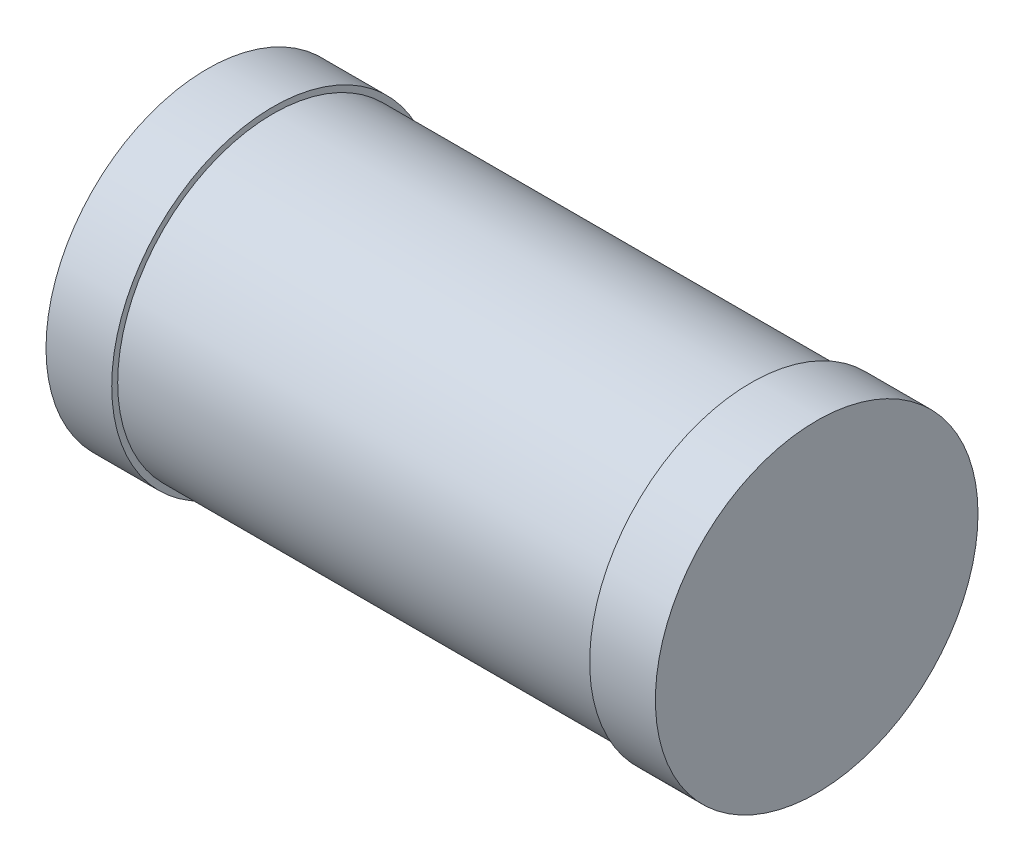
ISO-10303-21;
HEADER;
FILE_DESCRIPTION(('STEP AP214'),'2;1');
FILE_NAME('part.step','',(''),(''),'','','');
FILE_SCHEMA(('AUTOMOTIVE_DESIGN { 1 0 10303 214 1 1 1 1 }'));
ENDSEC;
DATA;
#1=APPLICATION_CONTEXT('core data for automotive mechanical design processes');
#2=APPLICATION_PROTOCOL_DEFINITION('international standard','automotive_design',2000,#1);
#3=PRODUCT_CONTEXT('',#1,'mechanical');
#4=PRODUCT('Part','Part','',(#3));
#5=PRODUCT_RELATED_PRODUCT_CATEGORY('part','',(#4));
#6=PRODUCT_DEFINITION_FORMATION('','',#4);
#7=PRODUCT_DEFINITION_CONTEXT('part definition',#1,'design');
#8=PRODUCT_DEFINITION('design','',#6,#7);
#9=PRODUCT_DEFINITION_SHAPE('','',#8);
#10=(LENGTH_UNIT() NAMED_UNIT(*) SI_UNIT(.MILLI.,.METRE.));
#11=(NAMED_UNIT(*) PLANE_ANGLE_UNIT() SI_UNIT($,.RADIAN.));
#12=(NAMED_UNIT(*) SI_UNIT($,.STERADIAN.) SOLID_ANGLE_UNIT());
#13=UNCERTAINTY_MEASURE_WITH_UNIT(LENGTH_MEASURE(1.E-05),#10,'distance_accuracy_value','');
#14=(GEOMETRIC_REPRESENTATION_CONTEXT(3) GLOBAL_UNCERTAINTY_ASSIGNED_CONTEXT((#13)) GLOBAL_UNIT_ASSIGNED_CONTEXT((#10,
#11,#12)) REPRESENTATION_CONTEXT('',''));
#15=CARTESIAN_POINT('',(0.,0.,0.));
#16=DIRECTION('',(0.,0.,1.));
#17=DIRECTION('',(1.,0.,0.));
#18=AXIS2_PLACEMENT_3D('',#15,#16,#17);
#19=CARTESIAN_POINT('',(-2.5,0.,0.));
#20=DIRECTION('',(1.,0.,0.));
#21=DIRECTION('',(0.,0.,-1.));
#22=AXIS2_PLACEMENT_3D('',#19,#20,#21);
#23=CYLINDRICAL_SURFACE('',#22,1.3);
#24=CARTESIAN_POINT('',(2.,0.,0.));
#25=DIRECTION('',(1.,0.,0.));
#26=DIRECTION('',(0.,0.,-1.));
#27=AXIS2_PLACEMENT_3D('',#24,#25,#26);
#28=CIRCLE('',#27,1.3);
#29=CARTESIAN_POINT('',(2.,0.,-1.3));
#30=VERTEX_POINT('',#29);
#31=EDGE_CURVE('E10',#30,#30,#28,.F.);
#32=ORIENTED_EDGE('',*,*,#31,.T.);
#33=EDGE_LOOP('',(#32));
#34=FACE_BOUND('',#33,.T.);
#35=CARTESIAN_POINT('',(-2.,0.,0.));
#36=DIRECTION('',(-1.,0.,0.));
#37=DIRECTION('',(0.,0.,1.));
#38=AXIS2_PLACEMENT_3D('',#35,#36,#37);
#39=CIRCLE('',#38,1.3);
#40=CARTESIAN_POINT('',(-2.,0.,1.3));
#41=VERTEX_POINT('',#40);
#42=EDGE_CURVE('E34',#41,#41,#39,.F.);
#43=ORIENTED_EDGE('',*,*,#42,.T.);
#44=EDGE_LOOP('',(#43));
#45=FACE_BOUND('',#44,.T.);
#46=ADVANCED_FACE('F31',(#34,#45),#23,.T.);
#47=CARTESIAN_POINT('',(2.55,0.,0.));
#48=DIRECTION('',(-1.,0.,0.));
#49=DIRECTION('',(0.,0.,1.));
#50=AXIS2_PLACEMENT_3D('',#47,#48,#49);
#51=CYLINDRICAL_SURFACE('',#50,1.35);
#52=CARTESIAN_POINT('',(2.55,0.,0.));
#53=DIRECTION('',(1.,0.,0.));
#54=DIRECTION('',(0.,0.,-1.));
#55=AXIS2_PLACEMENT_3D('',#52,#53,#54);
#56=CIRCLE('',#55,1.35);
#57=CARTESIAN_POINT('',(2.55,0.,-1.35));
#58=VERTEX_POINT('',#57);
#59=EDGE_CURVE('E38',#58,#58,#56,.T.);
#60=ORIENTED_EDGE('',*,*,#59,.F.);
#61=EDGE_LOOP('',(#60));
#62=FACE_BOUND('',#61,.T.);
#63=CARTESIAN_POINT('',(2.,0.,0.));
#64=DIRECTION('',(1.,0.,0.));
#65=DIRECTION('',(0.,0.,-1.));
#66=AXIS2_PLACEMENT_3D('',#63,#64,#65);
#67=CIRCLE('',#66,1.35);
#68=CARTESIAN_POINT('',(2.,0.,-1.35));
#69=VERTEX_POINT('',#68);
#70=EDGE_CURVE('E42',#69,#69,#67,.T.);
#71=ORIENTED_EDGE('',*,*,#70,.T.);
#72=EDGE_LOOP('',(#71));
#73=FACE_BOUND('',#72,.T.);
#74=ADVANCED_FACE('F68',(#62,#73),#51,.T.);
#75=CARTESIAN_POINT('',(2.55,0.,0.));
#76=DIRECTION('',(1.,0.,0.));
#77=DIRECTION('',(0.,0.,-1.));
#78=AXIS2_PLACEMENT_3D('',#75,#76,#77);
#79=PLANE('',#78);
#80=ORIENTED_EDGE('',*,*,#59,.T.);
#81=EDGE_LOOP('',(#80));
#82=FACE_BOUND('',#81,.T.);
#83=ADVANCED_FACE('F72',(#82),#79,.T.);
#84=CARTESIAN_POINT('',(2.,0.,0.));
#85=DIRECTION('',(1.,0.,0.));
#86=DIRECTION('',(0.,0.,-1.));
#87=AXIS2_PLACEMENT_3D('',#84,#85,#86);
#88=PLANE('',#87);
#89=ORIENTED_EDGE('',*,*,#31,.F.);
#90=EDGE_LOOP('',(#89));
#91=FACE_BOUND('',#90,.T.);
#92=ORIENTED_EDGE('',*,*,#70,.F.);
#93=EDGE_LOOP('',(#92));
#94=FACE_BOUND('',#93,.T.);
#95=ADVANCED_FACE('F79',(#91,#94),#88,.F.);
#96=CARTESIAN_POINT('',(-2.55,0.,0.));
#97=DIRECTION('',(1.,0.,0.));
#98=DIRECTION('',(0.,0.,-1.));
#99=AXIS2_PLACEMENT_3D('',#96,#97,#98);
#100=CYLINDRICAL_SURFACE('',#99,1.35);
#101=CARTESIAN_POINT('',(-2.55,0.,0.));
#102=DIRECTION('',(-1.,0.,0.));
#103=DIRECTION('',(0.,0.,1.));
#104=AXIS2_PLACEMENT_3D('',#101,#102,#103);
#105=CIRCLE('',#104,1.35);
#106=CARTESIAN_POINT('',(-2.55,0.,1.35));
#107=VERTEX_POINT('',#106);
#108=EDGE_CURVE('E47',#107,#107,#105,.T.);
#109=ORIENTED_EDGE('',*,*,#108,.F.);
#110=EDGE_LOOP('',(#109));
#111=FACE_BOUND('',#110,.T.);
#112=CARTESIAN_POINT('',(-2.,0.,0.));
#113=DIRECTION('',(-1.,0.,0.));
#114=DIRECTION('',(0.,0.,1.));
#115=AXIS2_PLACEMENT_3D('',#112,#113,#114);
#116=CIRCLE('',#115,1.35);
#117=CARTESIAN_POINT('',(-2.,0.,1.35));
#118=VERTEX_POINT('',#117);
#119=EDGE_CURVE('E50',#118,#118,#116,.T.);
#120=ORIENTED_EDGE('',*,*,#119,.T.);
#121=EDGE_LOOP('',(#120));
#122=FACE_BOUND('',#121,.T.);
#123=ADVANCED_FACE('F54',(#111,#122),#100,.T.);
#124=CARTESIAN_POINT('',(-2.55,0.,0.));
#125=DIRECTION('',(-1.,0.,0.));
#126=DIRECTION('',(0.,0.,1.));
#127=AXIS2_PLACEMENT_3D('',#124,#125,#126);
#128=PLANE('',#127);
#129=ORIENTED_EDGE('',*,*,#108,.T.);
#130=EDGE_LOOP('',(#129));
#131=FACE_BOUND('',#130,.T.);
#132=ADVANCED_FACE('F58',(#131),#128,.T.);
#133=CARTESIAN_POINT('',(-2.,0.,0.));
#134=DIRECTION('',(-1.,0.,0.));
#135=DIRECTION('',(0.,0.,1.));
#136=AXIS2_PLACEMENT_3D('',#133,#134,#135);
#137=PLANE('',#136);
#138=ORIENTED_EDGE('',*,*,#42,.F.);
#139=EDGE_LOOP('',(#138));
#140=FACE_BOUND('',#139,.T.);
#141=ORIENTED_EDGE('',*,*,#119,.F.);
#142=EDGE_LOOP('',(#141));
#143=FACE_BOUND('',#142,.T.);
#144=ADVANCED_FACE('F56',(#140,#143),#137,.F.);
#145=CLOSED_SHELL('',(#46,#74,#83,#95,#123,#132,#144));
#146=MANIFOLD_SOLID_BREP('B2',#145);
#147=ADVANCED_BREP_SHAPE_REPRESENTATION('',(#18,#146),#14);
#148=SHAPE_DEFINITION_REPRESENTATION(#9,#147);
ENDSEC;
END-ISO-10303-21;
